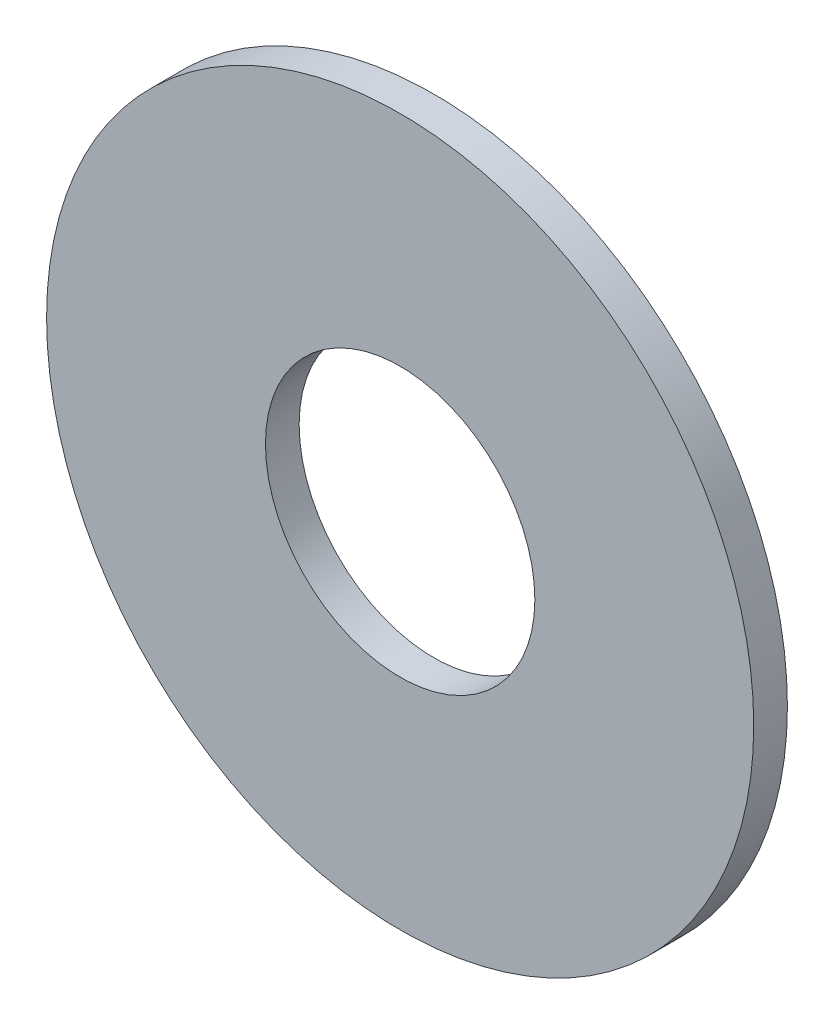
ISO-10303-21;
HEADER;
FILE_DESCRIPTION(('STEP AP214'),'2;1');
FILE_NAME('part.step','',(''),(''),'','','');
FILE_SCHEMA(('AUTOMOTIVE_DESIGN { 1 0 10303 214 1 1 1 1 }'));
ENDSEC;
DATA;
#1=APPLICATION_CONTEXT('core data for automotive mechanical design processes');
#2=APPLICATION_PROTOCOL_DEFINITION('international standard','automotive_design',2000,#1);
#3=PRODUCT_CONTEXT('',#1,'mechanical');
#4=PRODUCT('Part','Part','',(#3));
#5=PRODUCT_RELATED_PRODUCT_CATEGORY('part','',(#4));
#6=PRODUCT_DEFINITION_FORMATION('','',#4);
#7=PRODUCT_DEFINITION_CONTEXT('part definition',#1,'design');
#8=PRODUCT_DEFINITION('design','',#6,#7);
#9=PRODUCT_DEFINITION_SHAPE('','',#8);
#10=(LENGTH_UNIT() NAMED_UNIT(*) SI_UNIT(.MILLI.,.METRE.));
#11=(NAMED_UNIT(*) PLANE_ANGLE_UNIT() SI_UNIT($,.RADIAN.));
#12=(NAMED_UNIT(*) SI_UNIT($,.STERADIAN.) SOLID_ANGLE_UNIT());
#13=UNCERTAINTY_MEASURE_WITH_UNIT(LENGTH_MEASURE(1.E-05),#10,'distance_accuracy_value','');
#14=(GEOMETRIC_REPRESENTATION_CONTEXT(3) GLOBAL_UNCERTAINTY_ASSIGNED_CONTEXT((#13)) GLOBAL_UNIT_ASSIGNED_CONTEXT((#10,
#11,#12)) REPRESENTATION_CONTEXT('',''));
#15=CARTESIAN_POINT('',(0.,0.,0.));
#16=DIRECTION('',(0.,0.,1.));
#17=DIRECTION('',(1.,0.,0.));
#18=AXIS2_PLACEMENT_3D('',#15,#16,#17);
#19=CARTESIAN_POINT('',(0.,0.,2.));
#20=DIRECTION('',(0.,0.,1.));
#21=DIRECTION('',(1.,0.,0.));
#22=AXIS2_PLACEMENT_3D('',#19,#20,#21);
#23=PLANE('',#22);
#24=CARTESIAN_POINT('',(0.,0.,2.));
#25=DIRECTION('',(0.,0.,1.));
#26=DIRECTION('',(1.,0.,0.));
#27=AXIS2_PLACEMENT_3D('',#24,#25,#26);
#28=CIRCLE('',#27,21.);
#29=CARTESIAN_POINT('',(21.,0.,2.));
#30=VERTEX_POINT('',#29);
#31=EDGE_CURVE('E10',#30,#30,#28,.T.);
#32=ORIENTED_EDGE('',*,*,#31,.T.);
#33=EDGE_LOOP('',(#32));
#34=FACE_BOUND('',#33,.T.);
#35=CARTESIAN_POINT('',(0.,0.,2.));
#36=DIRECTION('',(0.,0.,1.));
#37=DIRECTION('',(1.,0.,0.));
#38=AXIS2_PLACEMENT_3D('',#35,#36,#37);
#39=CIRCLE('',#38,8.);
#40=CARTESIAN_POINT('',(8.,0.,2.));
#41=VERTEX_POINT('',#40);
#42=EDGE_CURVE('E50',#41,#41,#39,.T.);
#43=ORIENTED_EDGE('',*,*,#42,.F.);
#44=EDGE_LOOP('',(#43));
#45=FACE_BOUND('',#44,.T.);
#46=ADVANCED_FACE('F37',(#34,#45),#23,.T.);
#47=CARTESIAN_POINT('',(0.,0.,0.));
#48=DIRECTION('',(0.,0.,1.));
#49=DIRECTION('',(1.,0.,0.));
#50=AXIS2_PLACEMENT_3D('',#47,#48,#49);
#51=PLANE('',#50);
#52=CARTESIAN_POINT('',(0.,0.,0.));
#53=DIRECTION('',(0.,0.,1.));
#54=DIRECTION('',(1.,0.,0.));
#55=AXIS2_PLACEMENT_3D('',#52,#53,#54);
#56=CIRCLE('',#55,21.);
#57=CARTESIAN_POINT('',(21.,0.,0.));
#58=VERTEX_POINT('',#57);
#59=EDGE_CURVE('E41',#58,#58,#56,.T.);
#60=ORIENTED_EDGE('',*,*,#59,.F.);
#61=EDGE_LOOP('',(#60));
#62=FACE_BOUND('',#61,.T.);
#63=CARTESIAN_POINT('',(0.,0.,0.));
#64=DIRECTION('',(0.,0.,1.));
#65=DIRECTION('',(1.,0.,0.));
#66=AXIS2_PLACEMENT_3D('',#63,#64,#65);
#67=CIRCLE('',#66,8.);
#68=CARTESIAN_POINT('',(8.,0.,0.));
#69=VERTEX_POINT('',#68);
#70=EDGE_CURVE('E52',#69,#69,#67,.T.);
#71=ORIENTED_EDGE('',*,*,#70,.T.);
#72=EDGE_LOOP('',(#71));
#73=FACE_BOUND('',#72,.T.);
#74=ADVANCED_FACE('F64',(#62,#73),#51,.F.);
#75=CARTESIAN_POINT('',(0.,0.,2.));
#76=DIRECTION('',(0.,0.,-1.));
#77=DIRECTION('',(-1.,0.,0.));
#78=AXIS2_PLACEMENT_3D('',#75,#76,#77);
#79=CYLINDRICAL_SURFACE('',#78,21.);
#80=ORIENTED_EDGE('',*,*,#31,.F.);
#81=EDGE_LOOP('',(#80));
#82=FACE_BOUND('',#81,.T.);
#83=ORIENTED_EDGE('',*,*,#59,.T.);
#84=EDGE_LOOP('',(#83));
#85=FACE_BOUND('',#84,.T.);
#86=ADVANCED_FACE('F39',(#82,#85),#79,.T.);
#87=CARTESIAN_POINT('',(0.,0.,2.));
#88=DIRECTION('',(0.,0.,-1.));
#89=DIRECTION('',(-1.,0.,0.));
#90=AXIS2_PLACEMENT_3D('',#87,#88,#89);
#91=CYLINDRICAL_SURFACE('',#90,8.);
#92=ORIENTED_EDGE('',*,*,#42,.T.);
#93=EDGE_LOOP('',(#92));
#94=FACE_BOUND('',#93,.T.);
#95=ORIENTED_EDGE('',*,*,#70,.F.);
#96=EDGE_LOOP('',(#95));
#97=FACE_BOUND('',#96,.T.);
#98=ADVANCED_FACE('F60',(#94,#97),#91,.F.);
#99=CLOSED_SHELL('',(#46,#74,#86,#98));
#100=MANIFOLD_SOLID_BREP('B2',#99);
#101=ADVANCED_BREP_SHAPE_REPRESENTATION('',(#18,#100),#14);
#102=SHAPE_DEFINITION_REPRESENTATION(#9,#101);
ENDSEC;
END-ISO-10303-21;
